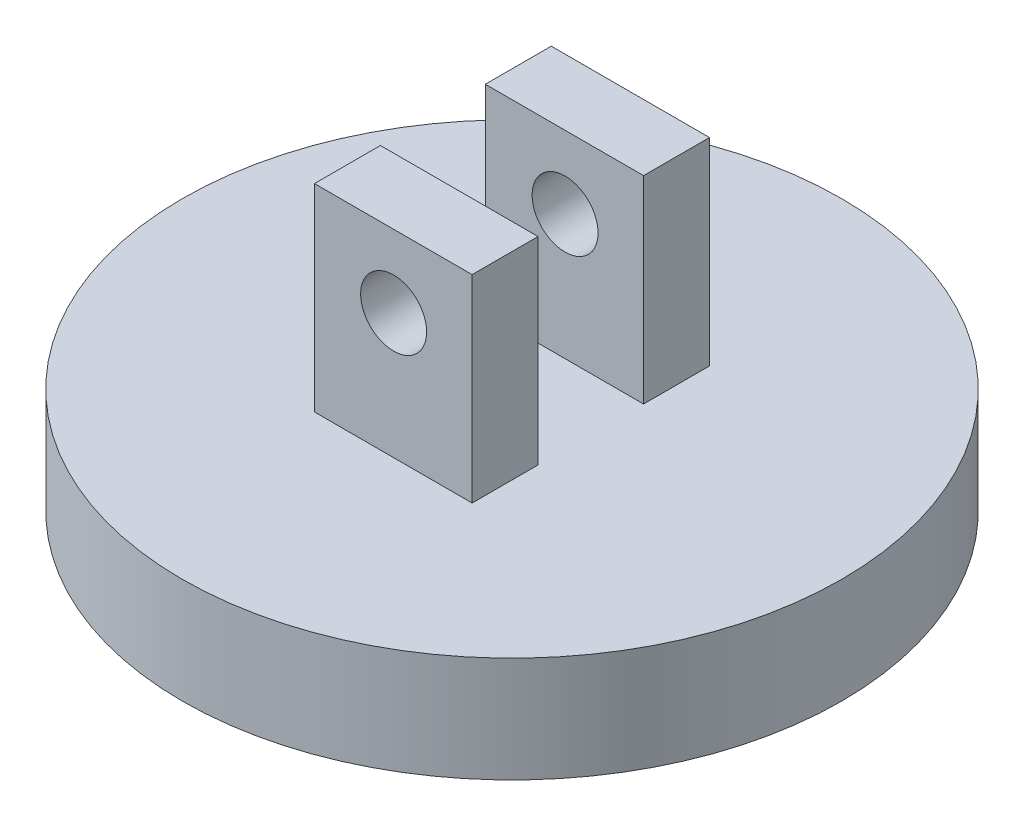
ISO-10303-21;
HEADER;
FILE_DESCRIPTION(('STEP AP214'),'2;1');
FILE_NAME('part.step','',(''),(''),'','','');
FILE_SCHEMA(('AUTOMOTIVE_DESIGN { 1 0 10303 214 1 1 1 1 }'));
ENDSEC;
DATA;
#1=APPLICATION_CONTEXT('core data for automotive mechanical design processes');
#2=APPLICATION_PROTOCOL_DEFINITION('international standard','automotive_design',2000,#1);
#3=PRODUCT_CONTEXT('',#1,'mechanical');
#4=PRODUCT('Part','Part','',(#3));
#5=PRODUCT_RELATED_PRODUCT_CATEGORY('part','',(#4));
#6=PRODUCT_DEFINITION_FORMATION('','',#4);
#7=PRODUCT_DEFINITION_CONTEXT('part definition',#1,'design');
#8=PRODUCT_DEFINITION('design','',#6,#7);
#9=PRODUCT_DEFINITION_SHAPE('','',#8);
#10=(LENGTH_UNIT() NAMED_UNIT(*) SI_UNIT(.MILLI.,.METRE.));
#11=(NAMED_UNIT(*) PLANE_ANGLE_UNIT() SI_UNIT($,.RADIAN.));
#12=(NAMED_UNIT(*) SI_UNIT($,.STERADIAN.) SOLID_ANGLE_UNIT());
#13=UNCERTAINTY_MEASURE_WITH_UNIT(LENGTH_MEASURE(1.E-05),#10,'distance_accuracy_value','');
#14=(GEOMETRIC_REPRESENTATION_CONTEXT(3) GLOBAL_UNCERTAINTY_ASSIGNED_CONTEXT((#13)) GLOBAL_UNIT_ASSIGNED_CONTEXT((#10,
#11,#12)) REPRESENTATION_CONTEXT('',''));
#15=CARTESIAN_POINT('',(0.,0.,0.));
#16=DIRECTION('',(0.,0.,1.));
#17=DIRECTION('',(1.,0.,0.));
#18=AXIS2_PLACEMENT_3D('',#15,#16,#17);
#19=CARTESIAN_POINT('',(0.,80.,0.));
#20=DIRECTION('',(0.,1.,0.));
#21=DIRECTION('',(0.,0.,1.));
#22=AXIS2_PLACEMENT_3D('',#19,#20,#21);
#23=PLANE('',#22);
#24=CARTESIAN_POINT('',(0.,80.,0.));
#25=DIRECTION('',(0.,1.,0.));
#26=DIRECTION('',(0.,0.,1.));
#27=AXIS2_PLACEMENT_3D('',#24,#25,#26);
#28=CIRCLE('',#27,250.);
#29=CARTESIAN_POINT('',(0.,80.,250.));
#30=VERTEX_POINT('',#29);
#31=EDGE_CURVE('E11',#30,#30,#28,.T.);
#32=ORIENTED_EDGE('',*,*,#31,.T.);
#33=EDGE_LOOP('',(#32));
#34=FACE_BOUND('',#33,.T.);
#35=DIRECTION('',(-1.,0.,0.));
#36=VECTOR('',#35,1.);
#37=CARTESIAN_POINT('',(-59.7635720201792,80.,40.));
#38=LINE('',#37,#36);
#39=CARTESIAN_POINT('',(59.7635720201792,80.,40.));
#40=VERTEX_POINT('',#39);
#41=CARTESIAN_POINT('',(-59.7635720201792,80.,40.));
#42=VERTEX_POINT('',#41);
#43=EDGE_CURVE('E161',#40,#42,#38,.T.);
#44=ORIENTED_EDGE('',*,*,#43,.F.);
#45=DIRECTION('',(0.,0.,-1.));
#46=VECTOR('',#45,1.);
#47=CARTESIAN_POINT('',(59.7635720201792,80.,90.));
#48=LINE('',#47,#46);
#49=CARTESIAN_POINT('',(59.7635720201792,80.,90.));
#50=VERTEX_POINT('',#49);
#51=EDGE_CURVE('E163',#50,#40,#48,.T.);
#52=ORIENTED_EDGE('',*,*,#51,.F.);
#53=DIRECTION('',(1.,0.,0.));
#54=VECTOR('',#53,1.);
#55=CARTESIAN_POINT('',(-59.7635720201792,80.,90.));
#56=LINE('',#55,#54);
#57=CARTESIAN_POINT('',(-59.7635720201792,80.,90.));
#58=VERTEX_POINT('',#57);
#59=EDGE_CURVE('E156',#58,#50,#56,.T.);
#60=ORIENTED_EDGE('',*,*,#59,.F.);
#61=DIRECTION('',(0.,0.,1.));
#62=VECTOR('',#61,1.);
#63=CARTESIAN_POINT('',(-59.7635720201792,80.,90.));
#64=LINE('',#63,#62);
#65=EDGE_CURVE('E158',#42,#58,#64,.T.);
#66=ORIENTED_EDGE('',*,*,#65,.F.);
#67=EDGE_LOOP('',(#44,#52,#60,#66));
#68=FACE_BOUND('',#67,.T.);
#69=DIRECTION('',(-1.,0.,0.));
#70=VECTOR('',#69,1.);
#71=CARTESIAN_POINT('',(-60.2364279798208,80.,-90.));
#72=LINE('',#71,#70);
#73=CARTESIAN_POINT('',(59.7635720201792,80.,-90.));
#74=VERTEX_POINT('',#73);
#75=CARTESIAN_POINT('',(-60.2364279798208,80.,-90.));
#76=VERTEX_POINT('',#75);
#77=EDGE_CURVE('E196',#74,#76,#72,.T.);
#78=ORIENTED_EDGE('',*,*,#77,.F.);
#79=DIRECTION('',(0.,0.,-1.));
#80=VECTOR('',#79,1.);
#81=CARTESIAN_POINT('',(59.7635720201792,80.,-90.));
#82=LINE('',#81,#80);
#83=CARTESIAN_POINT('',(59.7635720201792,80.,-40.));
#84=VERTEX_POINT('',#83);
#85=EDGE_CURVE('E138',#84,#74,#82,.T.);
#86=ORIENTED_EDGE('',*,*,#85,.F.);
#87=DIRECTION('',(1.,0.,0.));
#88=VECTOR('',#87,1.);
#89=CARTESIAN_POINT('',(-60.2364279798207,80.,-40.));
#90=LINE('',#89,#88);
#91=CARTESIAN_POINT('',(-60.2364279798207,80.,-40.));
#92=VERTEX_POINT('',#91);
#93=EDGE_CURVE('E134',#92,#84,#90,.T.);
#94=ORIENTED_EDGE('',*,*,#93,.F.);
#95=DIRECTION('',(0.,0.,1.));
#96=VECTOR('',#95,1.);
#97=CARTESIAN_POINT('',(-60.2364279798208,80.,-90.));
#98=LINE('',#97,#96);
#99=EDGE_CURVE('E198',#76,#92,#98,.T.);
#100=ORIENTED_EDGE('',*,*,#99,.F.);
#101=EDGE_LOOP('',(#78,#86,#94,#100));
#102=FACE_BOUND('',#101,.T.);
#103=ADVANCED_FACE('F47',(#34,#68,#102),#23,.T.);
#104=CARTESIAN_POINT('',(0.,80.,0.));
#105=DIRECTION('',(0.,-1.,0.));
#106=DIRECTION('',(0.,0.,-1.));
#107=AXIS2_PLACEMENT_3D('',#104,#105,#106);
#108=CYLINDRICAL_SURFACE('',#107,250.);
#109=ORIENTED_EDGE('',*,*,#31,.F.);
#110=EDGE_LOOP('',(#109));
#111=FACE_BOUND('',#110,.T.);
#112=CARTESIAN_POINT('',(0.,0.,0.));
#113=DIRECTION('',(0.,1.,0.));
#114=DIRECTION('',(0.,0.,1.));
#115=AXIS2_PLACEMENT_3D('',#112,#113,#114);
#116=CIRCLE('',#115,250.);
#117=CARTESIAN_POINT('',(0.,0.,250.));
#118=VERTEX_POINT('',#117);
#119=EDGE_CURVE('E56',#118,#118,#116,.T.);
#120=ORIENTED_EDGE('',*,*,#119,.T.);
#121=EDGE_LOOP('',(#120));
#122=FACE_BOUND('',#121,.T.);
#123=ADVANCED_FACE('F49',(#111,#122),#108,.T.);
#124=CARTESIAN_POINT('',(0.,0.,0.));
#125=DIRECTION('',(0.,1.,0.));
#126=DIRECTION('',(0.,0.,1.));
#127=AXIS2_PLACEMENT_3D('',#124,#125,#126);
#128=PLANE('',#127);
#129=ORIENTED_EDGE('',*,*,#119,.F.);
#130=EDGE_LOOP('',(#129));
#131=FACE_BOUND('',#130,.T.);
#132=ADVANCED_FACE('F243',(#131),#128,.F.);
#133=CARTESIAN_POINT('',(59.7635720201792,230.,90.));
#134=DIRECTION('',(-1.,0.,0.));
#135=DIRECTION('',(0.,0.,1.));
#136=AXIS2_PLACEMENT_3D('',#133,#134,#135);
#137=PLANE('',#136);
#138=ORIENTED_EDGE('',*,*,#51,.T.);
#139=DIRECTION('',(0.,-1.,0.));
#140=VECTOR('',#139,1.);
#141=CARTESIAN_POINT('',(59.7635720201792,230.,40.));
#142=LINE('',#141,#140);
#143=CARTESIAN_POINT('',(59.7635720201792,230.,40.));
#144=VERTEX_POINT('',#143);
#145=EDGE_CURVE('E145',#144,#40,#142,.T.);
#146=ORIENTED_EDGE('',*,*,#145,.F.);
#147=DIRECTION('',(0.,0.,-1.));
#148=VECTOR('',#147,1.);
#149=CARTESIAN_POINT('',(59.7635720201792,230.,90.));
#150=LINE('',#149,#148);
#151=CARTESIAN_POINT('',(59.7635720201792,230.,90.));
#152=VERTEX_POINT('',#151);
#153=EDGE_CURVE('E159',#152,#144,#150,.T.);
#154=ORIENTED_EDGE('',*,*,#153,.F.);
#155=DIRECTION('',(0.,-1.,0.));
#156=VECTOR('',#155,1.);
#157=CARTESIAN_POINT('',(59.7635720201792,230.,90.));
#158=LINE('',#157,#156);
#159=EDGE_CURVE('E152',#152,#50,#158,.T.);
#160=ORIENTED_EDGE('',*,*,#159,.T.);
#161=EDGE_LOOP('',(#138,#146,#154,#160));
#162=FACE_BOUND('',#161,.T.);
#163=ADVANCED_FACE('F179',(#162),#137,.F.);
#164=CARTESIAN_POINT('',(-59.7635720201792,230.,40.));
#165=DIRECTION('',(0.,0.,1.));
#166=DIRECTION('',(1.,0.,0.));
#167=AXIS2_PLACEMENT_3D('',#164,#165,#166);
#168=PLANE('',#167);
#169=CARTESIAN_POINT('',(0.23642797982075,175.,40.));
#170=DIRECTION('',(0.,0.,1.));
#171=DIRECTION('',(1.,0.,0.));
#172=AXIS2_PLACEMENT_3D('',#169,#170,#171);
#173=CIRCLE('',#172,25.);
#174=CARTESIAN_POINT('',(25.2364279798207,175.,40.));
#175=VERTEX_POINT('',#174);
#176=EDGE_CURVE('E148',#175,#175,#173,.T.);
#177=ORIENTED_EDGE('',*,*,#176,.T.);
#178=EDGE_LOOP('',(#177));
#179=FACE_BOUND('',#178,.T.);
#180=ORIENTED_EDGE('',*,*,#43,.T.);
#181=DIRECTION('',(0.,-1.,0.));
#182=VECTOR('',#181,1.);
#183=CARTESIAN_POINT('',(-59.7635720201792,230.,40.));
#184=LINE('',#183,#182);
#185=CARTESIAN_POINT('',(-59.7635720201792,230.,40.));
#186=VERTEX_POINT('',#185);
#187=EDGE_CURVE('E147',#186,#42,#184,.T.);
#188=ORIENTED_EDGE('',*,*,#187,.F.);
#189=DIRECTION('',(-1.,0.,0.));
#190=VECTOR('',#189,1.);
#191=CARTESIAN_POINT('',(-59.7635720201792,230.,40.));
#192=LINE('',#191,#190);
#193=EDGE_CURVE('E169',#144,#186,#192,.T.);
#194=ORIENTED_EDGE('',*,*,#193,.F.);
#195=ORIENTED_EDGE('',*,*,#145,.T.);
#196=EDGE_LOOP('',(#180,#188,#194,#195));
#197=FACE_BOUND('',#196,.T.);
#198=ADVANCED_FACE('F183',(#179,#197),#168,.F.);
#199=CARTESIAN_POINT('',(-59.7635720201792,230.,90.));
#200=DIRECTION('',(1.,0.,0.));
#201=DIRECTION('',(0.,0.,-1.));
#202=AXIS2_PLACEMENT_3D('',#199,#200,#201);
#203=PLANE('',#202);
#204=ORIENTED_EDGE('',*,*,#65,.T.);
#205=DIRECTION('',(0.,-1.,0.));
#206=VECTOR('',#205,1.);
#207=CARTESIAN_POINT('',(-59.7635720201792,230.,90.));
#208=LINE('',#207,#206);
#209=CARTESIAN_POINT('',(-59.7635720201792,230.,90.));
#210=VERTEX_POINT('',#209);
#211=EDGE_CURVE('E72',#210,#58,#208,.T.);
#212=ORIENTED_EDGE('',*,*,#211,.F.);
#213=DIRECTION('',(0.,0.,1.));
#214=VECTOR('',#213,1.);
#215=CARTESIAN_POINT('',(-59.7635720201792,230.,90.));
#216=LINE('',#215,#214);
#217=EDGE_CURVE('E167',#186,#210,#216,.T.);
#218=ORIENTED_EDGE('',*,*,#217,.F.);
#219=ORIENTED_EDGE('',*,*,#187,.T.);
#220=EDGE_LOOP('',(#204,#212,#218,#219));
#221=FACE_BOUND('',#220,.T.);
#222=ADVANCED_FACE('F187',(#221),#203,.F.);
#223=CARTESIAN_POINT('',(-59.7635720201792,230.,90.));
#224=DIRECTION('',(0.,0.,-1.));
#225=DIRECTION('',(-1.,0.,0.));
#226=AXIS2_PLACEMENT_3D('',#223,#224,#225);
#227=PLANE('',#226);
#228=CARTESIAN_POINT('',(0.23642797982075,175.,90.));
#229=DIRECTION('',(0.,0.,1.));
#230=DIRECTION('',(1.,0.,0.));
#231=AXIS2_PLACEMENT_3D('',#228,#229,#230);
#232=CIRCLE('',#231,25.);
#233=CARTESIAN_POINT('',(25.2364279798207,175.,90.));
#234=VERTEX_POINT('',#233);
#235=EDGE_CURVE('E213',#234,#234,#232,.T.);
#236=ORIENTED_EDGE('',*,*,#235,.F.);
#237=EDGE_LOOP('',(#236));
#238=FACE_BOUND('',#237,.T.);
#239=ORIENTED_EDGE('',*,*,#59,.T.);
#240=ORIENTED_EDGE('',*,*,#159,.F.);
#241=DIRECTION('',(1.,0.,0.));
#242=VECTOR('',#241,1.);
#243=CARTESIAN_POINT('',(-59.7635720201792,230.,90.));
#244=LINE('',#243,#242);
#245=EDGE_CURVE('E155',#210,#152,#244,.T.);
#246=ORIENTED_EDGE('',*,*,#245,.F.);
#247=ORIENTED_EDGE('',*,*,#211,.T.);
#248=EDGE_LOOP('',(#239,#240,#246,#247));
#249=FACE_BOUND('',#248,.T.);
#250=ADVANCED_FACE('F189',(#238,#249),#227,.F.);
#251=CARTESIAN_POINT('',(0.,230.,0.));
#252=DIRECTION('',(0.,-1.,0.));
#253=DIRECTION('',(0.,0.,-1.));
#254=AXIS2_PLACEMENT_3D('',#251,#252,#253);
#255=PLANE('',#254);
#256=ORIENTED_EDGE('',*,*,#153,.T.);
#257=ORIENTED_EDGE('',*,*,#193,.T.);
#258=ORIENTED_EDGE('',*,*,#217,.T.);
#259=ORIENTED_EDGE('',*,*,#245,.T.);
#260=EDGE_LOOP('',(#256,#257,#258,#259));
#261=FACE_BOUND('',#260,.T.);
#262=ADVANCED_FACE('F175',(#261),#255,.F.);
#263=CARTESIAN_POINT('',(59.7635720201792,230.,-90.));
#264=DIRECTION('',(-1.,0.,0.));
#265=DIRECTION('',(0.,0.,1.));
#266=AXIS2_PLACEMENT_3D('',#263,#264,#265);
#267=PLANE('',#266);
#268=ORIENTED_EDGE('',*,*,#85,.T.);
#269=DIRECTION('',(0.,-1.,0.));
#270=VECTOR('',#269,1.);
#271=CARTESIAN_POINT('',(59.7635720201792,230.,-90.));
#272=LINE('',#271,#270);
#273=CARTESIAN_POINT('',(59.7635720201792,230.,-90.));
#274=VERTEX_POINT('',#273);
#275=EDGE_CURVE('E119',#274,#74,#272,.T.);
#276=ORIENTED_EDGE('',*,*,#275,.F.);
#277=DIRECTION('',(0.,0.,-1.));
#278=VECTOR('',#277,1.);
#279=CARTESIAN_POINT('',(59.7635720201792,230.,-90.));
#280=LINE('',#279,#278);
#281=CARTESIAN_POINT('',(59.7635720201792,230.,-40.));
#282=VERTEX_POINT('',#281);
#283=EDGE_CURVE('E126',#282,#274,#280,.T.);
#284=ORIENTED_EDGE('',*,*,#283,.F.);
#285=DIRECTION('',(0.,-1.,0.));
#286=VECTOR('',#285,1.);
#287=CARTESIAN_POINT('',(59.7635720201792,230.,-40.));
#288=LINE('',#287,#286);
#289=EDGE_CURVE('E205',#282,#84,#288,.T.);
#290=ORIENTED_EDGE('',*,*,#289,.T.);
#291=EDGE_LOOP('',(#268,#276,#284,#290));
#292=FACE_BOUND('',#291,.T.);
#293=ADVANCED_FACE('F136',(#292),#267,.F.);
#294=CARTESIAN_POINT('',(-60.2364279798208,230.,-90.));
#295=DIRECTION('',(0.,0.,1.));
#296=DIRECTION('',(1.,0.,0.));
#297=AXIS2_PLACEMENT_3D('',#294,#295,#296);
#298=PLANE('',#297);
#299=CARTESIAN_POINT('',(0.23642797982075,175.,-90.));
#300=DIRECTION('',(0.,0.,1.));
#301=DIRECTION('',(1.,0.,0.));
#302=AXIS2_PLACEMENT_3D('',#299,#300,#301);
#303=CIRCLE('',#302,25.);
#304=CARTESIAN_POINT('',(25.2364279798207,175.,-90.));
#305=VERTEX_POINT('',#304);
#306=EDGE_CURVE('E210',#305,#305,#303,.T.);
#307=ORIENTED_EDGE('',*,*,#306,.T.);
#308=EDGE_LOOP('',(#307));
#309=FACE_BOUND('',#308,.T.);
#310=ORIENTED_EDGE('',*,*,#77,.T.);
#311=DIRECTION('',(0.,-1.,0.));
#312=VECTOR('',#311,1.);
#313=CARTESIAN_POINT('',(-60.2364279798208,230.,-90.));
#314=LINE('',#313,#312);
#315=CARTESIAN_POINT('',(-60.2364279798208,230.,-90.));
#316=VERTEX_POINT('',#315);
#317=EDGE_CURVE('E122',#316,#76,#314,.T.);
#318=ORIENTED_EDGE('',*,*,#317,.F.);
#319=DIRECTION('',(-1.,0.,0.));
#320=VECTOR('',#319,1.);
#321=CARTESIAN_POINT('',(-60.2364279798208,230.,-90.));
#322=LINE('',#321,#320);
#323=EDGE_CURVE('E115',#274,#316,#322,.T.);
#324=ORIENTED_EDGE('',*,*,#323,.F.);
#325=ORIENTED_EDGE('',*,*,#275,.T.);
#326=EDGE_LOOP('',(#310,#318,#324,#325));
#327=FACE_BOUND('',#326,.T.);
#328=ADVANCED_FACE('F117',(#309,#327),#298,.F.);
#329=CARTESIAN_POINT('',(-60.2364279798208,230.,-90.));
#330=DIRECTION('',(1.,0.,0.));
#331=DIRECTION('',(0.,0.,-1.));
#332=AXIS2_PLACEMENT_3D('',#329,#330,#331);
#333=PLANE('',#332);
#334=ORIENTED_EDGE('',*,*,#99,.T.);
#335=DIRECTION('',(0.,-1.,0.));
#336=VECTOR('',#335,1.);
#337=CARTESIAN_POINT('',(-60.2364279798207,230.,-40.));
#338=LINE('',#337,#336);
#339=CARTESIAN_POINT('',(-60.2364279798207,230.,-40.));
#340=VERTEX_POINT('',#339);
#341=EDGE_CURVE('E64',#340,#92,#338,.T.);
#342=ORIENTED_EDGE('',*,*,#341,.F.);
#343=DIRECTION('',(0.,0.,1.));
#344=VECTOR('',#343,1.);
#345=CARTESIAN_POINT('',(-60.2364279798208,230.,-90.));
#346=LINE('',#345,#344);
#347=EDGE_CURVE('E125',#316,#340,#346,.T.);
#348=ORIENTED_EDGE('',*,*,#347,.F.);
#349=ORIENTED_EDGE('',*,*,#317,.T.);
#350=EDGE_LOOP('',(#334,#342,#348,#349));
#351=FACE_BOUND('',#350,.T.);
#352=ADVANCED_FACE('F230',(#351),#333,.F.);
#353=CARTESIAN_POINT('',(-60.2364279798207,230.,-40.));
#354=DIRECTION('',(0.,0.,-1.));
#355=DIRECTION('',(-1.,0.,0.));
#356=AXIS2_PLACEMENT_3D('',#353,#354,#355);
#357=PLANE('',#356);
#358=CARTESIAN_POINT('',(0.23642797982075,175.,-40.));
#359=DIRECTION('',(0.,0.,-1.));
#360=DIRECTION('',(-1.,0.,0.));
#361=AXIS2_PLACEMENT_3D('',#358,#359,#360);
#362=CIRCLE('',#361,25.);
#363=CARTESIAN_POINT('',(-24.7635720201792,175.,-40.));
#364=VERTEX_POINT('',#363);
#365=EDGE_CURVE('E51',#364,#364,#362,.T.);
#366=ORIENTED_EDGE('',*,*,#365,.T.);
#367=EDGE_LOOP('',(#366));
#368=FACE_BOUND('',#367,.T.);
#369=ORIENTED_EDGE('',*,*,#93,.T.);
#370=ORIENTED_EDGE('',*,*,#289,.F.);
#371=DIRECTION('',(1.,0.,0.));
#372=VECTOR('',#371,1.);
#373=CARTESIAN_POINT('',(-60.2364279798207,230.,-40.));
#374=LINE('',#373,#372);
#375=EDGE_CURVE('E130',#340,#282,#374,.T.);
#376=ORIENTED_EDGE('',*,*,#375,.F.);
#377=ORIENTED_EDGE('',*,*,#341,.T.);
#378=EDGE_LOOP('',(#369,#370,#376,#377));
#379=FACE_BOUND('',#378,.T.);
#380=ADVANCED_FACE('F220',(#368,#379),#357,.F.);
#381=CARTESIAN_POINT('',(0.,230.,0.));
#382=DIRECTION('',(0.,1.,0.));
#383=DIRECTION('',(0.,0.,1.));
#384=AXIS2_PLACEMENT_3D('',#381,#382,#383);
#385=PLANE('',#384);
#386=ORIENTED_EDGE('',*,*,#283,.T.);
#387=ORIENTED_EDGE('',*,*,#323,.T.);
#388=ORIENTED_EDGE('',*,*,#347,.T.);
#389=ORIENTED_EDGE('',*,*,#375,.T.);
#390=EDGE_LOOP('',(#386,#387,#388,#389));
#391=FACE_BOUND('',#390,.T.);
#392=ADVANCED_FACE('F129',(#391),#385,.T.);
#393=CARTESIAN_POINT('',(0.23642797982075,175.,-250.));
#394=DIRECTION('',(0.,0.,1.));
#395=DIRECTION('',(1.,0.,0.));
#396=AXIS2_PLACEMENT_3D('',#393,#394,#395);
#397=CYLINDRICAL_SURFACE('',#396,25.);
#398=ORIENTED_EDGE('',*,*,#365,.F.);
#399=EDGE_LOOP('',(#398));
#400=FACE_BOUND('',#399,.T.);
#401=ORIENTED_EDGE('',*,*,#306,.F.);
#402=EDGE_LOOP('',(#401));
#403=FACE_BOUND('',#402,.T.);
#404=ADVANCED_FACE('F222',(#400,#403),#397,.F.);
#405=ORIENTED_EDGE('',*,*,#235,.T.);
#406=EDGE_LOOP('',(#405));
#407=FACE_BOUND('',#406,.T.);
#408=ORIENTED_EDGE('',*,*,#176,.F.);
#409=EDGE_LOOP('',(#408));
#410=FACE_BOUND('',#409,.T.);
#411=ADVANCED_FACE('F225',(#407,#410),#397,.F.);
#412=CLOSED_SHELL('',(#103,#123,#132,#163,#198,#222,#250,#262,#293,#328,#352,#380,#392,#404,#411));
#413=MANIFOLD_SOLID_BREP('B2',#412);
#414=ADVANCED_BREP_SHAPE_REPRESENTATION('',(#18,#413),#14);
#415=SHAPE_DEFINITION_REPRESENTATION(#9,#414);
ENDSEC;
END-ISO-10303-21;
